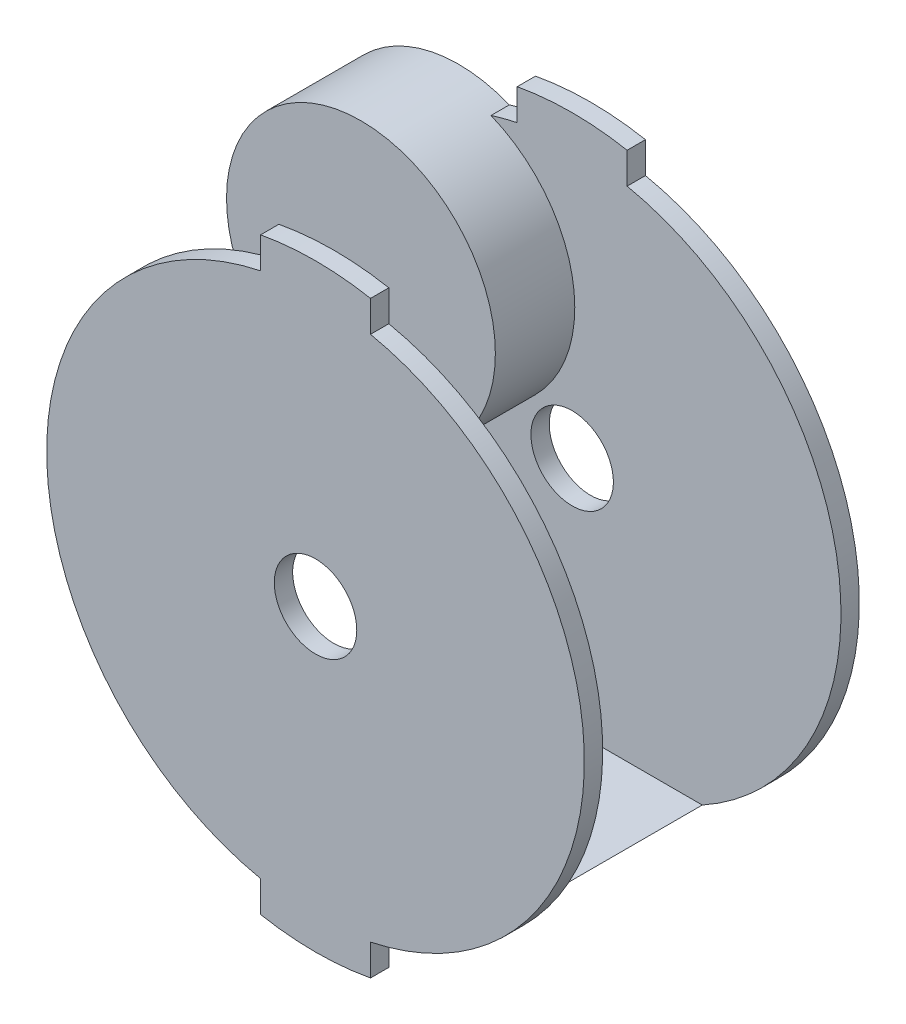
ISO-10303-21;
HEADER;
FILE_DESCRIPTION(('STEP AP214'),'2;1');
FILE_NAME('part.step','',(''),(''),'','','');
FILE_SCHEMA(('AUTOMOTIVE_DESIGN { 1 0 10303 214 1 1 1 1 }'));
ENDSEC;
DATA;
#1=APPLICATION_CONTEXT('core data for automotive mechanical design processes');
#2=APPLICATION_PROTOCOL_DEFINITION('international standard','automotive_design',2000,#1);
#3=PRODUCT_CONTEXT('',#1,'mechanical');
#4=PRODUCT('Part','Part','',(#3));
#5=PRODUCT_RELATED_PRODUCT_CATEGORY('part','',(#4));
#6=PRODUCT_DEFINITION_FORMATION('','',#4);
#7=PRODUCT_DEFINITION_CONTEXT('part definition',#1,'design');
#8=PRODUCT_DEFINITION('design','',#6,#7);
#9=PRODUCT_DEFINITION_SHAPE('','',#8);
#10=(LENGTH_UNIT() NAMED_UNIT(*) SI_UNIT(.MILLI.,.METRE.));
#11=(NAMED_UNIT(*) PLANE_ANGLE_UNIT() SI_UNIT($,.RADIAN.));
#12=(NAMED_UNIT(*) SI_UNIT($,.STERADIAN.) SOLID_ANGLE_UNIT());
#13=UNCERTAINTY_MEASURE_WITH_UNIT(LENGTH_MEASURE(1.E-05),#10,'distance_accuracy_value','');
#14=(GEOMETRIC_REPRESENTATION_CONTEXT(3) GLOBAL_UNCERTAINTY_ASSIGNED_CONTEXT((#13)) GLOBAL_UNIT_ASSIGNED_CONTEXT((#10,
#11,#12)) REPRESENTATION_CONTEXT('',''));
#15=CARTESIAN_POINT('',(0.,0.,0.));
#16=DIRECTION('',(0.,0.,1.));
#17=DIRECTION('',(1.,0.,0.));
#18=AXIS2_PLACEMENT_3D('',#15,#16,#17);
#19=CARTESIAN_POINT('',(0.,0.,11.43));
#20=DIRECTION('',(0.,0.,-1.));
#21=DIRECTION('',(-1.,0.,0.));
#22=AXIS2_PLACEMENT_3D('',#19,#20,#21);
#23=CYLINDRICAL_SURFACE('',#22,11.176);
#24=DIRECTION('',(0.,0.,-1.));
#25=VECTOR('',#24,1.);
#26=CARTESIAN_POINT('',(-3.37371252114498,10.6546252784727,2.032));
#27=LINE('',#26,#25);
#28=CARTESIAN_POINT('',(-3.37371252114498,10.6546252784727,0.762000000000001));
#29=VERTEX_POINT('',#28);
#30=CARTESIAN_POINT('',(-3.37371252114498,10.6546252784727,0.));
#31=VERTEX_POINT('',#30);
#32=EDGE_CURVE('E179',#29,#31,#27,.T.);
#33=ORIENTED_EDGE('',*,*,#32,.F.);
#34=CARTESIAN_POINT('',(0.,0.,0.761999999999999));
#35=DIRECTION('',(0.,0.,-1.));
#36=DIRECTION('',(0.,1.,0.));
#37=AXIS2_PLACEMENT_3D('',#34,#35,#36);
#38=CIRCLE('',#37,11.176);
#39=CARTESIAN_POINT('',(-2.286,10.9397065774179,0.762));
#40=VERTEX_POINT('',#39);
#41=EDGE_CURVE('E274',#29,#40,#38,.T.);
#42=ORIENTED_EDGE('',*,*,#41,.T.);
#43=DIRECTION('',(0.,0.,-1.));
#44=VECTOR('',#43,1.);
#45=CARTESIAN_POINT('',(-2.286,10.9397065774179,11.43));
#46=LINE('',#45,#44);
#47=CARTESIAN_POINT('',(-2.286,10.9397065774179,0.));
#48=VERTEX_POINT('',#47);
#49=EDGE_CURVE('E200',#40,#48,#46,.T.);
#50=ORIENTED_EDGE('',*,*,#49,.T.);
#51=CARTESIAN_POINT('',(0.,0.,0.));
#52=DIRECTION('',(0.,0.,1.));
#53=DIRECTION('',(1.,0.,0.));
#54=AXIS2_PLACEMENT_3D('',#51,#52,#53);
#55=CIRCLE('',#54,11.176);
#56=EDGE_CURVE('E194',#48,#31,#55,.T.);
#57=ORIENTED_EDGE('',*,*,#56,.T.);
#58=EDGE_LOOP('',(#33,#42,#50,#57));
#59=FACE_BOUND('',#58,.T.);
#60=ADVANCED_FACE('F33',(#59),#23,.T.);
#61=DIRECTION('',(0.,0.,-1.));
#62=VECTOR('',#61,1.);
#63=CARTESIAN_POINT('',(-10.6546252784727,3.37371252114501,2.032));
#64=LINE('',#63,#62);
#65=CARTESIAN_POINT('',(-10.6546252784727,3.37371252114501,0.));
#66=VERTEX_POINT('',#65);
#67=CARTESIAN_POINT('',(-10.6546252784727,3.37371252114501,0.762000000000001));
#68=VERTEX_POINT('',#67);
#69=EDGE_CURVE('E48',#66,#68,#64,.F.);
#70=ORIENTED_EDGE('',*,*,#69,.F.);
#71=CARTESIAN_POINT('',(-2.286,-10.9397065774179,0.));
#72=VERTEX_POINT('',#71);
#73=EDGE_CURVE('E196',#66,#72,#55,.T.);
#74=ORIENTED_EDGE('',*,*,#73,.T.);
#75=DIRECTION('',(0.,0.,-1.));
#76=VECTOR('',#75,1.);
#77=CARTESIAN_POINT('',(-2.286,-10.9397065774179,11.43));
#78=LINE('',#77,#76);
#79=CARTESIAN_POINT('',(-2.286,-10.9397065774179,0.762000000000001));
#80=VERTEX_POINT('',#79);
#81=EDGE_CURVE('E256',#80,#72,#78,.T.);
#82=ORIENTED_EDGE('',*,*,#81,.F.);
#83=CARTESIAN_POINT('',(0.,0.,0.762000000000001));
#84=DIRECTION('',(0.,0.,-1.));
#85=DIRECTION('',(-1.,0.,0.));
#86=AXIS2_PLACEMENT_3D('',#83,#84,#85);
#87=CIRCLE('',#86,11.176);
#88=CARTESIAN_POINT('',(-3.71352864537221,-10.541,0.762000000000001));
#89=VERTEX_POINT('',#88);
#90=EDGE_CURVE('E287',#80,#89,#87,.T.);
#91=ORIENTED_EDGE('',*,*,#90,.T.);
#92=DIRECTION('',(0.,0.,-1.));
#93=VECTOR('',#92,1.);
#94=CARTESIAN_POINT('',(-3.71352864537221,-10.541,11.43));
#95=LINE('',#94,#93);
#96=CARTESIAN_POINT('',(-3.71352864537221,-10.541,10.668));
#97=VERTEX_POINT('',#96);
#98=EDGE_CURVE('E281',#89,#97,#95,.F.);
#99=ORIENTED_EDGE('',*,*,#98,.T.);
#100=CARTESIAN_POINT('',(0.,0.,10.668));
#101=DIRECTION('',(0.,0.,1.));
#102=DIRECTION('',(1.,0.,0.));
#103=AXIS2_PLACEMENT_3D('',#100,#101,#102);
#104=CIRCLE('',#103,11.176);
#105=CARTESIAN_POINT('',(-2.286,-10.9397065774179,10.668));
#106=VERTEX_POINT('',#105);
#107=EDGE_CURVE('E284',#97,#106,#104,.T.);
#108=ORIENTED_EDGE('',*,*,#107,.T.);
#109=CARTESIAN_POINT('',(-2.286,-10.9397065774179,11.43));
#110=VERTEX_POINT('',#109);
#111=EDGE_CURVE('E257',#110,#106,#78,.T.);
#112=ORIENTED_EDGE('',*,*,#111,.F.);
#113=CARTESIAN_POINT('',(0.,0.,11.43));
#114=DIRECTION('',(0.,0.,1.));
#115=DIRECTION('',(1.,0.,0.));
#116=AXIS2_PLACEMENT_3D('',#113,#114,#115);
#117=CIRCLE('',#116,11.176);
#118=CARTESIAN_POINT('',(-2.286,10.9397065774179,11.43));
#119=VERTEX_POINT('',#118);
#120=EDGE_CURVE('E228',#119,#110,#117,.T.);
#121=ORIENTED_EDGE('',*,*,#120,.F.);
#122=CARTESIAN_POINT('',(-2.286,10.9397065774179,10.668));
#123=VERTEX_POINT('',#122);
#124=EDGE_CURVE('E229',#119,#123,#46,.T.);
#125=ORIENTED_EDGE('',*,*,#124,.T.);
#126=CARTESIAN_POINT('',(0.,0.,10.668));
#127=DIRECTION('',(0.,0.,1.));
#128=DIRECTION('',(0.,-1.,0.));
#129=AXIS2_PLACEMENT_3D('',#126,#127,#128);
#130=CIRCLE('',#129,11.176);
#131=CARTESIAN_POINT('',(-5.41055773465175,-9.779,10.668));
#132=VERTEX_POINT('',#131);
#133=EDGE_CURVE('E269',#123,#132,#130,.T.);
#134=ORIENTED_EDGE('',*,*,#133,.T.);
#135=DIRECTION('',(0.,0.,-1.));
#136=VECTOR('',#135,1.);
#137=CARTESIAN_POINT('',(-5.41055773465175,-9.779,11.43));
#138=LINE('',#137,#136);
#139=CARTESIAN_POINT('',(-5.41055773465175,-9.779,0.761999999999998));
#140=VERTEX_POINT('',#139);
#141=EDGE_CURVE('E278',#132,#140,#138,.T.);
#142=ORIENTED_EDGE('',*,*,#141,.T.);
#143=EDGE_CURVE('E394',#140,#68,#38,.T.);
#144=ORIENTED_EDGE('',*,*,#143,.T.);
#145=EDGE_LOOP('',(#70,#74,#82,#91,#99,#108,#112,#121,#125,#134,#142,#144));
#146=FACE_BOUND('',#145,.T.);
#147=ADVANCED_FACE('F361',(#146),#23,.T.);
#148=CARTESIAN_POINT('',(0.,11.176,0.762));
#149=DIRECTION('',(0.,0.,1.));
#150=DIRECTION('',(1.,0.,0.));
#151=AXIS2_PLACEMENT_3D('',#148,#149,#150);
#152=PLANE('',#151);
#153=CARTESIAN_POINT('',(0.,0.,0.761999999999999));
#154=DIRECTION('',(0.,0.,-1.));
#155=DIRECTION('',(0.,1.,0.));
#156=AXIS2_PLACEMENT_3D('',#153,#154,#155);
#157=CIRCLE('',#156,1.7145);
#158=CARTESIAN_POINT('',(0.,1.7145,0.761999999999999));
#159=VERTEX_POINT('',#158);
#160=EDGE_CURVE('E271',#159,#159,#157,.T.);
#161=ORIENTED_EDGE('',*,*,#160,.T.);
#162=EDGE_LOOP('',(#161));
#163=FACE_BOUND('',#162,.T.);
#164=ORIENTED_EDGE('',*,*,#41,.F.);
#165=CARTESIAN_POINT('',(-5.47795623385217,5.47795623385219,0.762000000000001));
#166=DIRECTION('',(0.,0.,1.));
#167=DIRECTION('',(1.,0.,0.));
#168=AXIS2_PLACEMENT_3D('',#165,#166,#167);
#169=CIRCLE('',#168,5.588);
#170=EDGE_CURVE('E11',#29,#68,#169,.F.);
#171=ORIENTED_EDGE('',*,*,#170,.T.);
#172=ORIENTED_EDGE('',*,*,#143,.F.);
#173=DIRECTION('',(1.,0.,0.));
#174=VECTOR('',#173,1.);
#175=CARTESIAN_POINT('',(-11.176,-9.779,0.761999999999998));
#176=LINE('',#175,#174);
#177=CARTESIAN_POINT('',(5.41055773465175,-9.779,0.761999999999998));
#178=VERTEX_POINT('',#177);
#179=EDGE_CURVE('E270',#140,#178,#176,.T.);
#180=ORIENTED_EDGE('',*,*,#179,.T.);
#181=CARTESIAN_POINT('',(2.286,10.9397065774179,0.762));
#182=VERTEX_POINT('',#181);
#183=EDGE_CURVE('E311',#182,#178,#38,.T.);
#184=ORIENTED_EDGE('',*,*,#183,.F.);
#185=DIRECTION('',(0.,1.,0.));
#186=VECTOR('',#185,1.);
#187=CARTESIAN_POINT('',(2.286,12.234260092053,0.762000000000001));
#188=LINE('',#187,#186);
#189=CARTESIAN_POINT('',(2.286,12.234260092053,0.762000000000001));
#190=VERTEX_POINT('',#189);
#191=EDGE_CURVE('E317',#182,#190,#188,.T.);
#192=ORIENTED_EDGE('',*,*,#191,.T.);
#193=CARTESIAN_POINT('',(0.,0.,0.762000000000001));
#194=DIRECTION('',(0.,0.,1.));
#195=DIRECTION('',(1.,0.,0.));
#196=AXIS2_PLACEMENT_3D('',#193,#194,#195);
#197=CIRCLE('',#196,12.446);
#198=CARTESIAN_POINT('',(-2.286,12.234260092053,0.762000000000001));
#199=VERTEX_POINT('',#198);
#200=EDGE_CURVE('E320',#190,#199,#197,.T.);
#201=ORIENTED_EDGE('',*,*,#200,.T.);
#202=DIRECTION('',(0.,-1.,0.));
#203=VECTOR('',#202,1.);
#204=CARTESIAN_POINT('',(-2.286,12.234260092053,0.762000000000001));
#205=LINE('',#204,#203);
#206=EDGE_CURVE('E262',#199,#40,#205,.T.);
#207=ORIENTED_EDGE('',*,*,#206,.T.);
#208=EDGE_LOOP('',(#164,#171,#172,#180,#184,#192,#201,#207));
#209=FACE_BOUND('',#208,.T.);
#210=ADVANCED_FACE('F417',(#163,#209),#152,.T.);
#211=DIRECTION('',(0.,0.,-1.));
#212=VECTOR('',#211,1.);
#213=CARTESIAN_POINT('',(3.71352864537221,-10.541,11.43));
#214=LINE('',#213,#212);
#215=CARTESIAN_POINT('',(3.71352864537221,-10.541,10.668));
#216=VERTEX_POINT('',#215);
#217=CARTESIAN_POINT('',(3.71352864537221,-10.541,0.762000000000001));
#218=VERTEX_POINT('',#217);
#219=EDGE_CURVE('E290',#216,#218,#214,.T.);
#220=ORIENTED_EDGE('',*,*,#219,.T.);
#221=CARTESIAN_POINT('',(2.286,-10.9397065774179,0.762000000000001));
#222=VERTEX_POINT('',#221);
#223=EDGE_CURVE('E41',#218,#222,#87,.T.);
#224=ORIENTED_EDGE('',*,*,#223,.T.);
#225=DIRECTION('',(0.,0.,-1.));
#226=VECTOR('',#225,1.);
#227=CARTESIAN_POINT('',(2.286,-10.9397065774179,11.43));
#228=LINE('',#227,#226);
#229=CARTESIAN_POINT('',(2.286,-10.9397065774179,0.));
#230=VERTEX_POINT('',#229);
#231=EDGE_CURVE('E244',#222,#230,#228,.T.);
#232=ORIENTED_EDGE('',*,*,#231,.T.);
#233=CARTESIAN_POINT('',(0.,0.,0.));
#234=DIRECTION('',(0.,0.,1.));
#235=DIRECTION('',(1.,0.,0.));
#236=AXIS2_PLACEMENT_3D('',#233,#234,#235);
#237=CIRCLE('',#236,11.176);
#238=CARTESIAN_POINT('',(2.286,10.9397065774179,0.));
#239=VERTEX_POINT('',#238);
#240=EDGE_CURVE('E217',#230,#239,#237,.T.);
#241=ORIENTED_EDGE('',*,*,#240,.T.);
#242=DIRECTION('',(0.,0.,-1.));
#243=VECTOR('',#242,1.);
#244=CARTESIAN_POINT('',(2.286,10.9397065774179,11.43));
#245=LINE('',#244,#243);
#246=EDGE_CURVE('E240',#182,#239,#245,.T.);
#247=ORIENTED_EDGE('',*,*,#246,.F.);
#248=ORIENTED_EDGE('',*,*,#183,.T.);
#249=DIRECTION('',(0.,0.,-1.));
#250=VECTOR('',#249,1.);
#251=CARTESIAN_POINT('',(5.41055773465175,-9.779,11.43));
#252=LINE('',#251,#250);
#253=CARTESIAN_POINT('',(5.41055773465175,-9.779,10.668));
#254=VERTEX_POINT('',#253);
#255=EDGE_CURVE('E265',#178,#254,#252,.F.);
#256=ORIENTED_EDGE('',*,*,#255,.T.);
#257=CARTESIAN_POINT('',(2.286,10.9397065774179,10.668));
#258=VERTEX_POINT('',#257);
#259=EDGE_CURVE('E275',#254,#258,#130,.T.);
#260=ORIENTED_EDGE('',*,*,#259,.T.);
#261=CARTESIAN_POINT('',(2.286,10.9397065774179,11.43));
#262=VERTEX_POINT('',#261);
#263=EDGE_CURVE('E241',#262,#258,#245,.T.);
#264=ORIENTED_EDGE('',*,*,#263,.F.);
#265=CARTESIAN_POINT('',(0.,0.,11.43));
#266=DIRECTION('',(0.,0.,1.));
#267=DIRECTION('',(1.,0.,0.));
#268=AXIS2_PLACEMENT_3D('',#265,#266,#267);
#269=CIRCLE('',#268,11.176);
#270=CARTESIAN_POINT('',(2.286,-10.9397065774179,11.43));
#271=VERTEX_POINT('',#270);
#272=EDGE_CURVE('E344',#271,#262,#269,.T.);
#273=ORIENTED_EDGE('',*,*,#272,.F.);
#274=CARTESIAN_POINT('',(2.286,-10.9397065774179,10.668));
#275=VERTEX_POINT('',#274);
#276=EDGE_CURVE('E245',#271,#275,#228,.T.);
#277=ORIENTED_EDGE('',*,*,#276,.T.);
#278=EDGE_CURVE('E288',#275,#216,#104,.T.);
#279=ORIENTED_EDGE('',*,*,#278,.T.);
#280=EDGE_LOOP('',(#220,#224,#232,#241,#247,#248,#256,#260,#264,#273,#277,#279));
#281=FACE_BOUND('',#280,.T.);
#282=ADVANCED_FACE('F296',(#281),#23,.T.);
#283=CARTESIAN_POINT('',(0.,0.,11.43));
#284=DIRECTION('',(0.,0.,-1.));
#285=DIRECTION('',(-1.,0.,0.));
#286=AXIS2_PLACEMENT_3D('',#283,#284,#285);
#287=CYLINDRICAL_SURFACE('',#286,1.7145);
#288=ORIENTED_EDGE('',*,*,#160,.F.);
#289=EDGE_LOOP('',(#288));
#290=FACE_BOUND('',#289,.T.);
#291=CARTESIAN_POINT('',(0.,0.,0.));
#292=DIRECTION('',(0.,0.,1.));
#293=DIRECTION('',(1.,0.,0.));
#294=AXIS2_PLACEMENT_3D('',#291,#292,#293);
#295=CIRCLE('',#294,1.7145);
#296=CARTESIAN_POINT('',(1.7145,0.,0.));
#297=VERTEX_POINT('',#296);
#298=EDGE_CURVE('E331',#297,#297,#295,.T.);
#299=ORIENTED_EDGE('',*,*,#298,.F.);
#300=EDGE_LOOP('',(#299));
#301=FACE_BOUND('',#300,.T.);
#302=ADVANCED_FACE('F441',(#290,#301),#287,.F.);
#303=CARTESIAN_POINT('',(-2.286,-10.9397065774179,11.43));
#304=DIRECTION('',(1.,0.,0.));
#305=DIRECTION('',(0.,0.,-1.));
#306=AXIS2_PLACEMENT_3D('',#303,#304,#305);
#307=PLANE('',#306);
#308=DIRECTION('',(0.,-1.,0.));
#309=VECTOR('',#308,1.);
#310=CARTESIAN_POINT('',(-2.286,-10.9397065774179,0.762000000000001));
#311=LINE('',#310,#309);
#312=CARTESIAN_POINT('',(-2.286,-12.234260092053,0.762000000000001));
#313=VERTEX_POINT('',#312);
#314=EDGE_CURVE('E329',#80,#313,#311,.T.);
#315=ORIENTED_EDGE('',*,*,#314,.F.);
#316=ORIENTED_EDGE('',*,*,#81,.T.);
#317=DIRECTION('',(0.,-1.,0.));
#318=VECTOR('',#317,1.);
#319=CARTESIAN_POINT('',(-2.286,-10.9397065774179,0.));
#320=LINE('',#319,#318);
#321=CARTESIAN_POINT('',(-2.286,-12.234260092053,0.));
#322=VERTEX_POINT('',#321);
#323=EDGE_CURVE('E202',#72,#322,#320,.T.);
#324=ORIENTED_EDGE('',*,*,#323,.T.);
#325=DIRECTION('',(0.,0.,-1.));
#326=VECTOR('',#325,1.);
#327=CARTESIAN_POINT('',(-2.286,-12.234260092053,11.43));
#328=LINE('',#327,#326);
#329=EDGE_CURVE('E252',#313,#322,#328,.T.);
#330=ORIENTED_EDGE('',*,*,#329,.F.);
#331=EDGE_LOOP('',(#315,#316,#324,#330));
#332=FACE_BOUND('',#331,.T.);
#333=ADVANCED_FACE('F35',(#332),#307,.F.);
#334=DIRECTION('',(0.,1.,0.));
#335=VECTOR('',#334,1.);
#336=CARTESIAN_POINT('',(-2.286,-10.9397065774179,10.668));
#337=LINE('',#336,#335);
#338=CARTESIAN_POINT('',(-2.286,-12.234260092053,10.668));
#339=VERTEX_POINT('',#338);
#340=EDGE_CURVE('E324',#339,#106,#337,.T.);
#341=ORIENTED_EDGE('',*,*,#340,.F.);
#342=CARTESIAN_POINT('',(-2.286,-12.234260092053,11.43));
#343=VERTEX_POINT('',#342);
#344=EDGE_CURVE('E253',#343,#339,#328,.T.);
#345=ORIENTED_EDGE('',*,*,#344,.F.);
#346=DIRECTION('',(0.,-1.,0.));
#347=VECTOR('',#346,1.);
#348=CARTESIAN_POINT('',(-2.286,-10.9397065774179,11.43));
#349=LINE('',#348,#347);
#350=EDGE_CURVE('E338',#110,#343,#349,.T.);
#351=ORIENTED_EDGE('',*,*,#350,.F.);
#352=ORIENTED_EDGE('',*,*,#111,.T.);
#353=EDGE_LOOP('',(#341,#345,#351,#352));
#354=FACE_BOUND('',#353,.T.);
#355=ADVANCED_FACE('F364',(#354),#307,.F.);
#356=CARTESIAN_POINT('',(0.,0.,11.43));
#357=DIRECTION('',(0.,0.,-1.));
#358=DIRECTION('',(-1.,0.,0.));
#359=AXIS2_PLACEMENT_3D('',#356,#357,#358);
#360=CYLINDRICAL_SURFACE('',#359,12.446);
#361=CARTESIAN_POINT('',(0.,0.,0.762000000000001));
#362=DIRECTION('',(0.,0.,1.));
#363=DIRECTION('',(1.,0.,0.));
#364=AXIS2_PLACEMENT_3D('',#361,#362,#363);
#365=CIRCLE('',#364,12.446);
#366=CARTESIAN_POINT('',(2.286,-12.234260092053,0.762000000000001));
#367=VERTEX_POINT('',#366);
#368=EDGE_CURVE('E322',#313,#367,#365,.T.);
#369=ORIENTED_EDGE('',*,*,#368,.F.);
#370=ORIENTED_EDGE('',*,*,#329,.T.);
#371=CARTESIAN_POINT('',(0.,0.,0.));
#372=DIRECTION('',(0.,0.,1.));
#373=DIRECTION('',(1.,0.,0.));
#374=AXIS2_PLACEMENT_3D('',#371,#372,#373);
#375=CIRCLE('',#374,12.446);
#376=CARTESIAN_POINT('',(2.286,-12.234260092053,0.));
#377=VERTEX_POINT('',#376);
#378=EDGE_CURVE('E205',#322,#377,#375,.T.);
#379=ORIENTED_EDGE('',*,*,#378,.T.);
#380=DIRECTION('',(0.,0.,-1.));
#381=VECTOR('',#380,1.);
#382=CARTESIAN_POINT('',(2.286,-12.234260092053,11.43));
#383=LINE('',#382,#381);
#384=EDGE_CURVE('E248',#367,#377,#383,.T.);
#385=ORIENTED_EDGE('',*,*,#384,.F.);
#386=EDGE_LOOP('',(#369,#370,#379,#385));
#387=FACE_BOUND('',#386,.T.);
#388=ADVANCED_FACE('F467',(#387),#360,.T.);
#389=CARTESIAN_POINT('',(0.,0.,10.668));
#390=DIRECTION('',(0.,0.,-1.));
#391=DIRECTION('',(-1.,0.,0.));
#392=AXIS2_PLACEMENT_3D('',#389,#390,#391);
#393=CIRCLE('',#392,12.446);
#394=CARTESIAN_POINT('',(2.286,-12.234260092053,10.668));
#395=VERTEX_POINT('',#394);
#396=EDGE_CURVE('E373',#395,#339,#393,.T.);
#397=ORIENTED_EDGE('',*,*,#396,.F.);
#398=CARTESIAN_POINT('',(2.286,-12.234260092053,11.43));
#399=VERTEX_POINT('',#398);
#400=EDGE_CURVE('E249',#399,#395,#383,.T.);
#401=ORIENTED_EDGE('',*,*,#400,.F.);
#402=CARTESIAN_POINT('',(0.,0.,11.43));
#403=DIRECTION('',(0.,0.,1.));
#404=DIRECTION('',(1.,0.,0.));
#405=AXIS2_PLACEMENT_3D('',#402,#403,#404);
#406=CIRCLE('',#405,12.446);
#407=EDGE_CURVE('E340',#343,#399,#406,.T.);
#408=ORIENTED_EDGE('',*,*,#407,.F.);
#409=ORIENTED_EDGE('',*,*,#344,.T.);
#410=EDGE_LOOP('',(#397,#401,#408,#409));
#411=FACE_BOUND('',#410,.T.);
#412=ADVANCED_FACE('F372',(#411),#360,.T.);
#413=CARTESIAN_POINT('',(2.286,-10.9397065774179,11.43));
#414=DIRECTION('',(-1.,0.,0.));
#415=DIRECTION('',(0.,0.,1.));
#416=AXIS2_PLACEMENT_3D('',#413,#414,#415);
#417=PLANE('',#416);
#418=DIRECTION('',(0.,1.,0.));
#419=VECTOR('',#418,1.);
#420=CARTESIAN_POINT('',(2.286,-10.9397065774179,0.762000000000001));
#421=LINE('',#420,#419);
#422=EDGE_CURVE('E303',#367,#222,#421,.T.);
#423=ORIENTED_EDGE('',*,*,#422,.F.);
#424=ORIENTED_EDGE('',*,*,#384,.T.);
#425=DIRECTION('',(0.,1.,0.));
#426=VECTOR('',#425,1.);
#427=CARTESIAN_POINT('',(2.286,-10.9397065774179,0.));
#428=LINE('',#427,#426);
#429=EDGE_CURVE('E214',#377,#230,#428,.T.);
#430=ORIENTED_EDGE('',*,*,#429,.T.);
#431=ORIENTED_EDGE('',*,*,#231,.F.);
#432=EDGE_LOOP('',(#423,#424,#430,#431));
#433=FACE_BOUND('',#432,.T.);
#434=ADVANCED_FACE('F302',(#433),#417,.F.);
#435=DIRECTION('',(0.,-1.,0.));
#436=VECTOR('',#435,1.);
#437=CARTESIAN_POINT('',(2.286,-10.9397065774179,10.668));
#438=LINE('',#437,#436);
#439=EDGE_CURVE('E378',#275,#395,#438,.T.);
#440=ORIENTED_EDGE('',*,*,#439,.F.);
#441=ORIENTED_EDGE('',*,*,#276,.F.);
#442=DIRECTION('',(0.,1.,0.));
#443=VECTOR('',#442,1.);
#444=CARTESIAN_POINT('',(2.286,-10.9397065774179,11.43));
#445=LINE('',#444,#443);
#446=EDGE_CURVE('E342',#399,#271,#445,.T.);
#447=ORIENTED_EDGE('',*,*,#446,.F.);
#448=ORIENTED_EDGE('',*,*,#400,.T.);
#449=EDGE_LOOP('',(#440,#441,#447,#448));
#450=FACE_BOUND('',#449,.T.);
#451=ADVANCED_FACE('F376',(#450),#417,.F.);
#452=CARTESIAN_POINT('',(2.286,12.234260092053,11.43));
#453=DIRECTION('',(-1.,0.,0.));
#454=DIRECTION('',(0.,0.,1.));
#455=AXIS2_PLACEMENT_3D('',#452,#453,#454);
#456=PLANE('',#455);
#457=ORIENTED_EDGE('',*,*,#191,.F.);
#458=ORIENTED_EDGE('',*,*,#246,.T.);
#459=DIRECTION('',(0.,1.,0.));
#460=VECTOR('',#459,1.);
#461=CARTESIAN_POINT('',(2.286,12.234260092053,0.));
#462=LINE('',#461,#460);
#463=CARTESIAN_POINT('',(2.286,12.234260092053,0.));
#464=VERTEX_POINT('',#463);
#465=EDGE_CURVE('E220',#239,#464,#462,.T.);
#466=ORIENTED_EDGE('',*,*,#465,.T.);
#467=DIRECTION('',(0.,0.,-1.));
#468=VECTOR('',#467,1.);
#469=CARTESIAN_POINT('',(2.286,12.234260092053,11.43));
#470=LINE('',#469,#468);
#471=EDGE_CURVE('E236',#190,#464,#470,.T.);
#472=ORIENTED_EDGE('',*,*,#471,.F.);
#473=EDGE_LOOP('',(#457,#458,#466,#472));
#474=FACE_BOUND('',#473,.T.);
#475=ADVANCED_FACE('F315',(#474),#456,.F.);
#476=DIRECTION('',(0.,-1.,0.));
#477=VECTOR('',#476,1.);
#478=CARTESIAN_POINT('',(2.286,12.234260092053,10.668));
#479=LINE('',#478,#477);
#480=CARTESIAN_POINT('',(2.286,12.234260092053,10.668));
#481=VERTEX_POINT('',#480);
#482=EDGE_CURVE('E386',#481,#258,#479,.T.);
#483=ORIENTED_EDGE('',*,*,#482,.F.);
#484=CARTESIAN_POINT('',(2.286,12.234260092053,11.43));
#485=VERTEX_POINT('',#484);
#486=EDGE_CURVE('E237',#485,#481,#470,.T.);
#487=ORIENTED_EDGE('',*,*,#486,.F.);
#488=DIRECTION('',(0.,1.,0.));
#489=VECTOR('',#488,1.);
#490=CARTESIAN_POINT('',(2.286,12.234260092053,11.43));
#491=LINE('',#490,#489);
#492=EDGE_CURVE('E346',#262,#485,#491,.T.);
#493=ORIENTED_EDGE('',*,*,#492,.F.);
#494=ORIENTED_EDGE('',*,*,#263,.T.);
#495=EDGE_LOOP('',(#483,#487,#493,#494));
#496=FACE_BOUND('',#495,.T.);
#497=ADVANCED_FACE('F384',(#496),#456,.F.);
#498=CARTESIAN_POINT('',(0.,0.,11.43));
#499=DIRECTION('',(0.,0.,-1.));
#500=DIRECTION('',(-1.,0.,0.));
#501=AXIS2_PLACEMENT_3D('',#498,#499,#500);
#502=CYLINDRICAL_SURFACE('',#501,12.446);
#503=ORIENTED_EDGE('',*,*,#200,.F.);
#504=ORIENTED_EDGE('',*,*,#471,.T.);
#505=CARTESIAN_POINT('',(0.,0.,0.));
#506=DIRECTION('',(0.,0.,1.));
#507=DIRECTION('',(1.,0.,0.));
#508=AXIS2_PLACEMENT_3D('',#505,#506,#507);
#509=CIRCLE('',#508,12.446);
#510=CARTESIAN_POINT('',(-2.286,12.234260092053,0.));
#511=VERTEX_POINT('',#510);
#512=EDGE_CURVE('E223',#464,#511,#509,.T.);
#513=ORIENTED_EDGE('',*,*,#512,.T.);
#514=DIRECTION('',(0.,0.,-1.));
#515=VECTOR('',#514,1.);
#516=CARTESIAN_POINT('',(-2.286,12.234260092053,11.43));
#517=LINE('',#516,#515);
#518=EDGE_CURVE('E232',#199,#511,#517,.T.);
#519=ORIENTED_EDGE('',*,*,#518,.F.);
#520=EDGE_LOOP('',(#503,#504,#513,#519));
#521=FACE_BOUND('',#520,.T.);
#522=ADVANCED_FACE('F423',(#521),#502,.T.);
#523=CARTESIAN_POINT('',(0.,0.,10.668));
#524=DIRECTION('',(0.,0.,-1.));
#525=DIRECTION('',(-1.,0.,0.));
#526=AXIS2_PLACEMENT_3D('',#523,#524,#525);
#527=CIRCLE('',#526,12.446);
#528=CARTESIAN_POINT('',(-2.286,12.234260092053,10.668));
#529=VERTEX_POINT('',#528);
#530=EDGE_CURVE('E390',#529,#481,#527,.T.);
#531=ORIENTED_EDGE('',*,*,#530,.F.);
#532=CARTESIAN_POINT('',(-2.286,12.234260092053,11.43));
#533=VERTEX_POINT('',#532);
#534=EDGE_CURVE('E233',#533,#529,#517,.T.);
#535=ORIENTED_EDGE('',*,*,#534,.F.);
#536=CARTESIAN_POINT('',(0.,0.,11.43));
#537=DIRECTION('',(0.,0.,1.));
#538=DIRECTION('',(1.,0.,0.));
#539=AXIS2_PLACEMENT_3D('',#536,#537,#538);
#540=CIRCLE('',#539,12.446);
#541=EDGE_CURVE('E347',#485,#533,#540,.T.);
#542=ORIENTED_EDGE('',*,*,#541,.F.);
#543=ORIENTED_EDGE('',*,*,#486,.T.);
#544=EDGE_LOOP('',(#531,#535,#542,#543));
#545=FACE_BOUND('',#544,.T.);
#546=ADVANCED_FACE('F389',(#545),#502,.T.);
#547=CARTESIAN_POINT('',(-2.286,12.234260092053,11.43));
#548=DIRECTION('',(1.,0.,0.));
#549=DIRECTION('',(0.,0.,-1.));
#550=AXIS2_PLACEMENT_3D('',#547,#548,#549);
#551=PLANE('',#550);
#552=ORIENTED_EDGE('',*,*,#206,.F.);
#553=ORIENTED_EDGE('',*,*,#518,.T.);
#554=DIRECTION('',(0.,-1.,0.));
#555=VECTOR('',#554,1.);
#556=CARTESIAN_POINT('',(-2.286,12.234260092053,0.));
#557=LINE('',#556,#555);
#558=EDGE_CURVE('E226',#511,#48,#557,.T.);
#559=ORIENTED_EDGE('',*,*,#558,.T.);
#560=ORIENTED_EDGE('',*,*,#49,.F.);
#561=EDGE_LOOP('',(#552,#553,#559,#560));
#562=FACE_BOUND('',#561,.T.);
#563=ADVANCED_FACE('F421',(#562),#551,.F.);
#564=DIRECTION('',(0.,1.,0.));
#565=VECTOR('',#564,1.);
#566=CARTESIAN_POINT('',(-2.286,12.234260092053,10.668));
#567=LINE('',#566,#565);
#568=EDGE_CURVE('E260',#123,#529,#567,.T.);
#569=ORIENTED_EDGE('',*,*,#568,.F.);
#570=ORIENTED_EDGE('',*,*,#124,.F.);
#571=DIRECTION('',(0.,-1.,0.));
#572=VECTOR('',#571,1.);
#573=CARTESIAN_POINT('',(-2.286,12.234260092053,11.43));
#574=LINE('',#573,#572);
#575=EDGE_CURVE('E209',#533,#119,#574,.T.);
#576=ORIENTED_EDGE('',*,*,#575,.F.);
#577=ORIENTED_EDGE('',*,*,#534,.T.);
#578=EDGE_LOOP('',(#569,#570,#576,#577));
#579=FACE_BOUND('',#578,.T.);
#580=ADVANCED_FACE('F359',(#579),#551,.F.);
#581=CARTESIAN_POINT('',(0.,0.,11.43));
#582=DIRECTION('',(0.,0.,1.));
#583=DIRECTION('',(1.,0.,0.));
#584=AXIS2_PLACEMENT_3D('',#581,#582,#583);
#585=PLANE('',#584);
#586=ORIENTED_EDGE('',*,*,#120,.T.);
#587=ORIENTED_EDGE('',*,*,#350,.T.);
#588=ORIENTED_EDGE('',*,*,#407,.T.);
#589=ORIENTED_EDGE('',*,*,#446,.T.);
#590=ORIENTED_EDGE('',*,*,#272,.T.);
#591=ORIENTED_EDGE('',*,*,#492,.T.);
#592=ORIENTED_EDGE('',*,*,#541,.T.);
#593=ORIENTED_EDGE('',*,*,#575,.T.);
#594=EDGE_LOOP('',(#586,#587,#588,#589,#590,#591,#592,#593));
#595=FACE_BOUND('',#594,.T.);
#596=CARTESIAN_POINT('',(0.,0.,11.43));
#597=DIRECTION('',(0.,0.,1.));
#598=DIRECTION('',(1.,0.,0.));
#599=AXIS2_PLACEMENT_3D('',#596,#597,#598);
#600=CIRCLE('',#599,1.7145);
#601=CARTESIAN_POINT('',(1.7145,0.,11.43));
#602=VERTEX_POINT('',#601);
#603=EDGE_CURVE('E207',#602,#602,#600,.T.);
#604=ORIENTED_EDGE('',*,*,#603,.F.);
#605=EDGE_LOOP('',(#604));
#606=FACE_BOUND('',#605,.T.);
#607=ADVANCED_FACE('F353',(#595,#606),#585,.T.);
#608=CARTESIAN_POINT('',(0.,0.,0.));
#609=DIRECTION('',(0.,0.,1.));
#610=DIRECTION('',(1.,0.,0.));
#611=AXIS2_PLACEMENT_3D('',#608,#609,#610);
#612=PLANE('',#611);
#613=CARTESIAN_POINT('',(-5.47795623385217,5.47795623385219,0.));
#614=DIRECTION('',(0.,0.,1.));
#615=DIRECTION('',(1.,0.,0.));
#616=AXIS2_PLACEMENT_3D('',#613,#614,#615);
#617=CIRCLE('',#616,5.588);
#618=EDGE_CURVE('E182',#31,#66,#617,.T.);
#619=ORIENTED_EDGE('',*,*,#618,.F.);
#620=ORIENTED_EDGE('',*,*,#56,.F.);
#621=ORIENTED_EDGE('',*,*,#558,.F.);
#622=ORIENTED_EDGE('',*,*,#512,.F.);
#623=ORIENTED_EDGE('',*,*,#465,.F.);
#624=ORIENTED_EDGE('',*,*,#240,.F.);
#625=ORIENTED_EDGE('',*,*,#429,.F.);
#626=ORIENTED_EDGE('',*,*,#378,.F.);
#627=ORIENTED_EDGE('',*,*,#323,.F.);
#628=ORIENTED_EDGE('',*,*,#73,.F.);
#629=EDGE_LOOP('',(#619,#620,#621,#622,#623,#624,#625,#626,#627,#628));
#630=FACE_BOUND('',#629,.T.);
#631=ORIENTED_EDGE('',*,*,#298,.T.);
#632=EDGE_LOOP('',(#631));
#633=FACE_BOUND('',#632,.T.);
#634=ADVANCED_FACE('F191',(#630,#633),#612,.F.);
#635=CARTESIAN_POINT('',(0.,0.,10.668));
#636=DIRECTION('',(0.,0.,1.));
#637=DIRECTION('',(0.,-1.,0.));
#638=AXIS2_PLACEMENT_3D('',#635,#636,#637);
#639=CIRCLE('',#638,1.7145);
#640=CARTESIAN_POINT('',(0.,-1.7145,10.668));
#641=VERTEX_POINT('',#640);
#642=EDGE_CURVE('E266',#641,#641,#639,.T.);
#643=ORIENTED_EDGE('',*,*,#642,.F.);
#644=EDGE_LOOP('',(#643));
#645=FACE_BOUND('',#644,.T.);
#646=ORIENTED_EDGE('',*,*,#603,.T.);
#647=EDGE_LOOP('',(#646));
#648=FACE_BOUND('',#647,.T.);
#649=ADVANCED_FACE('F448',(#645,#648),#287,.F.);
#650=CARTESIAN_POINT('',(0.,11.176,10.668));
#651=DIRECTION('',(0.,0.,-1.));
#652=DIRECTION('',(-1.,0.,0.));
#653=AXIS2_PLACEMENT_3D('',#650,#651,#652);
#654=PLANE('',#653);
#655=ORIENTED_EDGE('',*,*,#482,.T.);
#656=ORIENTED_EDGE('',*,*,#259,.F.);
#657=DIRECTION('',(1.,0.,0.));
#658=VECTOR('',#657,1.);
#659=CARTESIAN_POINT('',(-11.176,-9.779,10.668));
#660=LINE('',#659,#658);
#661=EDGE_CURVE('E401',#132,#254,#660,.T.);
#662=ORIENTED_EDGE('',*,*,#661,.F.);
#663=ORIENTED_EDGE('',*,*,#133,.F.);
#664=ORIENTED_EDGE('',*,*,#568,.T.);
#665=ORIENTED_EDGE('',*,*,#530,.T.);
#666=EDGE_LOOP('',(#655,#656,#662,#663,#664,#665));
#667=FACE_BOUND('',#666,.T.);
#668=ORIENTED_EDGE('',*,*,#642,.T.);
#669=EDGE_LOOP('',(#668));
#670=FACE_BOUND('',#669,.T.);
#671=ADVANCED_FACE('F412',(#667,#670),#654,.T.);
#672=ORIENTED_EDGE('',*,*,#422,.T.);
#673=ORIENTED_EDGE('',*,*,#223,.F.);
#674=DIRECTION('',(1.,0.,0.));
#675=VECTOR('',#674,1.);
#676=CARTESIAN_POINT('',(-11.176,-10.541,0.762000000000001));
#677=LINE('',#676,#675);
#678=EDGE_CURVE('E186',#89,#218,#677,.T.);
#679=ORIENTED_EDGE('',*,*,#678,.F.);
#680=ORIENTED_EDGE('',*,*,#90,.F.);
#681=ORIENTED_EDGE('',*,*,#314,.T.);
#682=ORIENTED_EDGE('',*,*,#368,.T.);
#683=EDGE_LOOP('',(#672,#673,#679,#680,#681,#682));
#684=FACE_BOUND('',#683,.T.);
#685=ADVANCED_FACE('F452',(#684),#152,.T.);
#686=ORIENTED_EDGE('',*,*,#340,.T.);
#687=ORIENTED_EDGE('',*,*,#107,.F.);
#688=DIRECTION('',(1.,0.,0.));
#689=VECTOR('',#688,1.);
#690=CARTESIAN_POINT('',(-11.176,-10.541,10.668));
#691=LINE('',#690,#689);
#692=EDGE_CURVE('E55',#97,#216,#691,.T.);
#693=ORIENTED_EDGE('',*,*,#692,.T.);
#694=ORIENTED_EDGE('',*,*,#278,.F.);
#695=ORIENTED_EDGE('',*,*,#439,.T.);
#696=ORIENTED_EDGE('',*,*,#396,.T.);
#697=EDGE_LOOP('',(#686,#687,#693,#694,#695,#696));
#698=FACE_BOUND('',#697,.T.);
#699=ADVANCED_FACE('F400',(#698),#654,.T.);
#700=CARTESIAN_POINT('',(-11.176,-9.779,0.761999999999998));
#701=DIRECTION('',(0.,-1.,0.));
#702=DIRECTION('',(0.,0.,-1.));
#703=AXIS2_PLACEMENT_3D('',#700,#701,#702);
#704=PLANE('',#703);
#705=ORIENTED_EDGE('',*,*,#661,.T.);
#706=ORIENTED_EDGE('',*,*,#255,.F.);
#707=ORIENTED_EDGE('',*,*,#179,.F.);
#708=ORIENTED_EDGE('',*,*,#141,.F.);
#709=EDGE_LOOP('',(#705,#706,#707,#708));
#710=FACE_BOUND('',#709,.T.);
#711=ADVANCED_FACE('F416',(#710),#704,.F.);
#712=CARTESIAN_POINT('',(-11.176,-10.541,0.762000000000001));
#713=DIRECTION('',(0.,1.,0.));
#714=DIRECTION('',(0.,0.,1.));
#715=AXIS2_PLACEMENT_3D('',#712,#713,#714);
#716=PLANE('',#715);
#717=ORIENTED_EDGE('',*,*,#692,.F.);
#718=ORIENTED_EDGE('',*,*,#98,.F.);
#719=ORIENTED_EDGE('',*,*,#678,.T.);
#720=ORIENTED_EDGE('',*,*,#219,.F.);
#721=EDGE_LOOP('',(#717,#718,#719,#720));
#722=FACE_BOUND('',#721,.T.);
#723=ADVANCED_FACE('F478',(#722),#716,.F.);
#724=CARTESIAN_POINT('',(-5.47795623385217,5.47795623385219,4.064));
#725=DIRECTION('',(0.,0.,-1.));
#726=DIRECTION('',(-1.,0.,0.));
#727=AXIS2_PLACEMENT_3D('',#724,#725,#726);
#728=CYLINDRICAL_SURFACE('',#727,5.588);
#729=CARTESIAN_POINT('',(-5.47795623385217,5.47795623385219,4.064));
#730=DIRECTION('',(0.,0.,1.));
#731=DIRECTION('',(1.,0.,0.));
#732=AXIS2_PLACEMENT_3D('',#729,#730,#731);
#733=CIRCLE('',#732,5.588);
#734=CARTESIAN_POINT('',(0.110043766147826,5.47795623385219,4.064));
#735=VERTEX_POINT('',#734);
#736=EDGE_CURVE('E197',#735,#735,#733,.T.);
#737=ORIENTED_EDGE('',*,*,#736,.F.);
#738=EDGE_LOOP('',(#737));
#739=FACE_BOUND('',#738,.T.);
#740=ORIENTED_EDGE('',*,*,#170,.F.);
#741=ORIENTED_EDGE('',*,*,#32,.T.);
#742=ORIENTED_EDGE('',*,*,#618,.T.);
#743=ORIENTED_EDGE('',*,*,#69,.T.);
#744=EDGE_LOOP('',(#740,#741,#742,#743));
#745=FACE_BOUND('',#744,.T.);
#746=ADVANCED_FACE('F181',(#739,#745),#728,.T.);
#747=CARTESIAN_POINT('',(-5.47795623385217,5.47795623385219,4.064));
#748=DIRECTION('',(0.,0.,1.));
#749=DIRECTION('',(1.,0.,0.));
#750=AXIS2_PLACEMENT_3D('',#747,#748,#749);
#751=PLANE('',#750);
#752=ORIENTED_EDGE('',*,*,#736,.T.);
#753=EDGE_LOOP('',(#752));
#754=FACE_BOUND('',#753,.T.);
#755=ADVANCED_FACE('F475',(#754),#751,.T.);
#756=CLOSED_SHELL('',(#60,#147,#210,#282,#302,#333,#355,#388,#412,#434,#451,#475,#497,#522,#546,
#563,#580,#607,#634,#649,#671,#685,#699,#711,#723,#746,#755));
#757=MANIFOLD_SOLID_BREP('B2',#756);
#758=ADVANCED_BREP_SHAPE_REPRESENTATION('',(#18,#757),#14);
#759=SHAPE_DEFINITION_REPRESENTATION(#9,#758);
ENDSEC;
END-ISO-10303-21;
